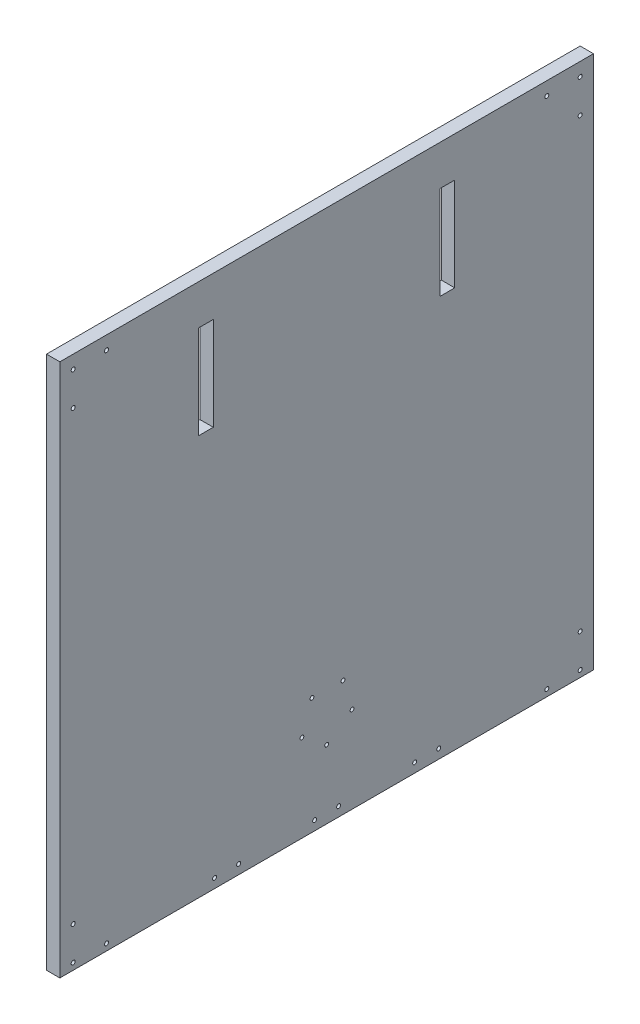
ISO-10303-21;
HEADER;
FILE_DESCRIPTION(('STEP AP214'),'2;1');
FILE_NAME('part.step','',(''),(''),'','','');
FILE_SCHEMA(('AUTOMOTIVE_DESIGN { 1 0 10303 214 1 1 1 1 }'));
ENDSEC;
DATA;
#1=APPLICATION_CONTEXT('core data for automotive mechanical design processes');
#2=APPLICATION_PROTOCOL_DEFINITION('international standard','automotive_design',2000,#1);
#3=PRODUCT_CONTEXT('',#1,'mechanical');
#4=PRODUCT('Part','Part','',(#3));
#5=PRODUCT_RELATED_PRODUCT_CATEGORY('part','',(#4));
#6=PRODUCT_DEFINITION_FORMATION('','',#4);
#7=PRODUCT_DEFINITION_CONTEXT('part definition',#1,'design');
#8=PRODUCT_DEFINITION('design','',#6,#7);
#9=PRODUCT_DEFINITION_SHAPE('','',#8);
#10=(LENGTH_UNIT() NAMED_UNIT(*) SI_UNIT(.MILLI.,.METRE.));
#11=(NAMED_UNIT(*) PLANE_ANGLE_UNIT() SI_UNIT($,.RADIAN.));
#12=(NAMED_UNIT(*) SI_UNIT($,.STERADIAN.) SOLID_ANGLE_UNIT());
#13=UNCERTAINTY_MEASURE_WITH_UNIT(LENGTH_MEASURE(1.E-05),#10,'distance_accuracy_value','');
#14=(GEOMETRIC_REPRESENTATION_CONTEXT(3) GLOBAL_UNCERTAINTY_ASSIGNED_CONTEXT((#13)) GLOBAL_UNIT_ASSIGNED_CONTEXT((#10,
#11,#12)) REPRESENTATION_CONTEXT('',''));
#15=CARTESIAN_POINT('',(0.,0.,0.));
#16=DIRECTION('',(0.,0.,1.));
#17=DIRECTION('',(1.,0.,0.));
#18=AXIS2_PLACEMENT_3D('',#15,#16,#17);
#19=CARTESIAN_POINT('',(10.,0.,0.));
#20=DIRECTION('',(1.,0.,0.));
#21=DIRECTION('',(0.,0.,-1.));
#22=AXIS2_PLACEMENT_3D('',#19,#20,#21);
#23=PLANE('',#22);
#24=DIRECTION('',(0.,0.,-1.));
#25=VECTOR('',#24,1.);
#26=CARTESIAN_POINT('',(10.,170.,96.));
#27=LINE('',#26,#25);
#28=CARTESIAN_POINT('',(10.,170.,96.));
#29=VERTEX_POINT('',#28);
#30=CARTESIAN_POINT('',(10.,170.,85.));
#31=VERTEX_POINT('',#30);
#32=EDGE_CURVE('E134',#29,#31,#27,.T.);
#33=ORIENTED_EDGE('',*,*,#32,.T.);
#34=DIRECTION('',(0.,-1.,0.));
#35=VECTOR('',#34,1.);
#36=CARTESIAN_POINT('',(10.,170.,85.));
#37=LINE('',#36,#35);
#38=CARTESIAN_POINT('',(10.,100.,85.));
#39=VERTEX_POINT('',#38);
#40=EDGE_CURVE('E146',#31,#39,#37,.T.);
#41=ORIENTED_EDGE('',*,*,#40,.T.);
#42=DIRECTION('',(0.,0.,1.));
#43=VECTOR('',#42,1.);
#44=CARTESIAN_POINT('',(10.,100.,85.));
#45=LINE('',#44,#43);
#46=CARTESIAN_POINT('',(10.,100.,96.));
#47=VERTEX_POINT('',#46);
#48=EDGE_CURVE('E57',#39,#47,#45,.T.);
#49=ORIENTED_EDGE('',*,*,#48,.T.);
#50=DIRECTION('',(0.,1.,0.));
#51=VECTOR('',#50,1.);
#52=CARTESIAN_POINT('',(10.,100.,96.));
#53=LINE('',#52,#51);
#54=EDGE_CURVE('E143',#47,#29,#53,.T.);
#55=ORIENTED_EDGE('',*,*,#54,.T.);
#56=EDGE_LOOP('',(#33,#41,#49,#55));
#57=FACE_BOUND('',#56,.T.);
#58=CARTESIAN_POINT('',(10.,-113.022211572453,-12.2380282533939));
#59=DIRECTION('',(1.,0.,0.));
#60=DIRECTION('',(0.,0.,-1.));
#61=AXIS2_PLACEMENT_3D('',#58,#59,#60);
#62=CIRCLE('',#61,1.45000000000002);
#63=CARTESIAN_POINT('',(10.,-113.022211572453,-13.6880282533939));
#64=VERTEX_POINT('',#63);
#65=EDGE_CURVE('E244',#64,#64,#62,.T.);
#66=ORIENTED_EDGE('',*,*,#65,.F.);
#67=EDGE_LOOP('',(#66));
#68=FACE_BOUND('',#67,.T.);
#69=CARTESIAN_POINT('',(10.,-134.607193772722,18.571414113098));
#70=DIRECTION('',(1.,0.,0.));
#71=DIRECTION('',(0.,0.,-1.));
#72=AXIS2_PLACEMENT_3D('',#69,#70,#71);
#73=CIRCLE('',#72,1.44999999999999);
#74=CARTESIAN_POINT('',(10.,-134.607193772722,17.121414113098));
#75=VERTEX_POINT('',#74);
#76=EDGE_CURVE('E227',#75,#75,#73,.T.);
#77=ORIENTED_EDGE('',*,*,#76,.F.);
#78=EDGE_LOOP('',(#77));
#79=FACE_BOUND('',#78,.T.);
#80=CARTESIAN_POINT('',(10.,-135.253912203802,-19.0412825569231));
#81=DIRECTION('',(1.,0.,0.));
#82=DIRECTION('',(0.,0.,-1.));
#83=AXIS2_PLACEMENT_3D('',#80,#81,#82);
#84=CIRCLE('',#83,1.44999999999997);
#85=CARTESIAN_POINT('',(10.,-135.253912203802,-20.491282556923));
#86=VERTEX_POINT('',#85);
#87=EDGE_CURVE('E228',#86,#86,#84,.T.);
#88=ORIENTED_EDGE('',*,*,#87,.F.);
#89=EDGE_LOOP('',(#88));
#90=FACE_BOUND('',#89,.T.);
#91=CARTESIAN_POINT('',(10.,-148.59416485013,0.));
#92=DIRECTION('',(1.,0.,0.));
#93=DIRECTION('',(0.,0.,-1.));
#94=AXIS2_PLACEMENT_3D('',#91,#92,#93);
#95=CIRCLE('',#94,1.44999999999995);
#96=CARTESIAN_POINT('',(10.,-148.59416485013,-1.45000000000003));
#97=VERTEX_POINT('',#96);
#98=EDGE_CURVE('E177',#97,#97,#95,.T.);
#99=ORIENTED_EDGE('',*,*,#98,.F.);
#100=EDGE_LOOP('',(#99));
#101=FACE_BOUND('',#100,.T.);
#102=CARTESIAN_POINT('',(10.,-112.622517600894,11.0078966972191));
#103=DIRECTION('',(1.,0.,0.));
#104=DIRECTION('',(0.,0.,-1.));
#105=AXIS2_PLACEMENT_3D('',#102,#103,#104);
#106=CIRCLE('',#105,1.45000000000004);
#107=CARTESIAN_POINT('',(10.,-112.622517600894,9.55789669721902));
#108=VERTEX_POINT('',#107);
#109=EDGE_CURVE('E243',#108,#108,#106,.T.);
#110=ORIENTED_EDGE('',*,*,#109,.F.);
#111=EDGE_LOOP('',(#110));
#112=FACE_BOUND('',#111,.T.);
#113=CARTESIAN_POINT('',(10.,190.,165.));
#114=DIRECTION('',(-1.,0.,0.));
#115=DIRECTION('',(0.,0.,1.));
#116=AXIS2_PLACEMENT_3D('',#113,#114,#115);
#117=CIRCLE('',#116,1.5);
#118=CARTESIAN_POINT('',(10.,190.,166.5));
#119=VERTEX_POINT('',#118);
#120=EDGE_CURVE('E276',#119,#119,#117,.T.);
#121=ORIENTED_EDGE('',*,*,#120,.T.);
#122=EDGE_LOOP('',(#121));
#123=FACE_BOUND('',#122,.T.);
#124=CARTESIAN_POINT('',(10.,165.,190.));
#125=DIRECTION('',(-1.,0.,0.));
#126=DIRECTION('',(0.,0.,1.));
#127=AXIS2_PLACEMENT_3D('',#124,#125,#126);
#128=CIRCLE('',#127,1.5);
#129=CARTESIAN_POINT('',(10.,165.,191.5));
#130=VERTEX_POINT('',#129);
#131=EDGE_CURVE('E284',#130,#130,#128,.T.);
#132=ORIENTED_EDGE('',*,*,#131,.T.);
#133=EDGE_LOOP('',(#132));
#134=FACE_BOUND('',#133,.T.);
#135=CARTESIAN_POINT('',(10.,-195.,190.));
#136=DIRECTION('',(-1.,0.,0.));
#137=DIRECTION('',(0.,0.,1.));
#138=AXIS2_PLACEMENT_3D('',#135,#136,#137);
#139=CIRCLE('',#138,1.5);
#140=CARTESIAN_POINT('',(10.,-195.,191.5));
#141=VERTEX_POINT('',#140);
#142=EDGE_CURVE('E292',#141,#141,#139,.T.);
#143=ORIENTED_EDGE('',*,*,#142,.T.);
#144=EDGE_LOOP('',(#143));
#145=FACE_BOUND('',#144,.T.);
#146=CARTESIAN_POINT('',(10.,-195.,165.));
#147=DIRECTION('',(-1.,0.,0.));
#148=DIRECTION('',(0.,0.,1.));
#149=AXIS2_PLACEMENT_3D('',#146,#147,#148);
#150=CIRCLE('',#149,1.5);
#151=CARTESIAN_POINT('',(10.,-195.,166.5));
#152=VERTEX_POINT('',#151);
#153=EDGE_CURVE('E267',#152,#152,#150,.T.);
#154=ORIENTED_EDGE('',*,*,#153,.T.);
#155=EDGE_LOOP('',(#154));
#156=FACE_BOUND('',#155,.T.);
#157=CARTESIAN_POINT('',(10.,-170.,190.));
#158=DIRECTION('',(-1.,0.,0.));
#159=DIRECTION('',(0.,0.,1.));
#160=AXIS2_PLACEMENT_3D('',#157,#158,#159);
#161=CIRCLE('',#160,1.5);
#162=CARTESIAN_POINT('',(10.,-170.,191.5));
#163=VERTEX_POINT('',#162);
#164=EDGE_CURVE('E259',#163,#163,#161,.T.);
#165=ORIENTED_EDGE('',*,*,#164,.T.);
#166=EDGE_LOOP('',(#165));
#167=FACE_BOUND('',#166,.T.);
#168=CARTESIAN_POINT('',(10.,190.,190.));
#169=DIRECTION('',(-1.,0.,0.));
#170=DIRECTION('',(0.,0.,1.));
#171=AXIS2_PLACEMENT_3D('',#168,#169,#170);
#172=CIRCLE('',#171,1.5);
#173=CARTESIAN_POINT('',(10.,190.,191.5));
#174=VERTEX_POINT('',#173);
#175=EDGE_CURVE('E275',#174,#174,#172,.T.);
#176=ORIENTED_EDGE('',*,*,#175,.T.);
#177=EDGE_LOOP('',(#176));
#178=FACE_BOUND('',#177,.T.);
#179=CARTESIAN_POINT('',(10.,-193.,84.));
#180=DIRECTION('',(1.,0.,0.));
#181=DIRECTION('',(0.,0.,-1.));
#182=AXIS2_PLACEMENT_3D('',#179,#180,#181);
#183=CIRCLE('',#182,1.5);
#184=CARTESIAN_POINT('',(10.,-193.,82.5));
#185=VERTEX_POINT('',#184);
#186=EDGE_CURVE('E316',#185,#185,#183,.T.);
#187=ORIENTED_EDGE('',*,*,#186,.F.);
#188=EDGE_LOOP('',(#187));
#189=FACE_BOUND('',#188,.T.);
#190=CARTESIAN_POINT('',(10.,-193.,66.));
#191=DIRECTION('',(1.,0.,0.));
#192=DIRECTION('',(0.,0.,-1.));
#193=AXIS2_PLACEMENT_3D('',#190,#191,#192);
#194=CIRCLE('',#193,1.5);
#195=CARTESIAN_POINT('',(10.,-193.,64.5));
#196=VERTEX_POINT('',#195);
#197=EDGE_CURVE('E324',#196,#196,#194,.T.);
#198=ORIENTED_EDGE('',*,*,#197,.F.);
#199=EDGE_LOOP('',(#198));
#200=FACE_BOUND('',#199,.T.);
#201=CARTESIAN_POINT('',(10.,-193.,9.));
#202=DIRECTION('',(1.,0.,0.));
#203=DIRECTION('',(0.,0.,-1.));
#204=AXIS2_PLACEMENT_3D('',#201,#202,#203);
#205=CIRCLE('',#204,1.5);
#206=CARTESIAN_POINT('',(10.,-193.,7.5));
#207=VERTEX_POINT('',#206);
#208=EDGE_CURVE('E332',#207,#207,#205,.T.);
#209=ORIENTED_EDGE('',*,*,#208,.F.);
#210=EDGE_LOOP('',(#209));
#211=FACE_BOUND('',#210,.T.);
#212=CARTESIAN_POINT('',(10.,-193.,-9.));
#213=DIRECTION('',(1.,0.,0.));
#214=DIRECTION('',(0.,0.,-1.));
#215=AXIS2_PLACEMENT_3D('',#212,#213,#214);
#216=CIRCLE('',#215,1.5);
#217=CARTESIAN_POINT('',(10.,-193.,-10.5));
#218=VERTEX_POINT('',#217);
#219=EDGE_CURVE('E340',#218,#218,#216,.T.);
#220=ORIENTED_EDGE('',*,*,#219,.F.);
#221=EDGE_LOOP('',(#220));
#222=FACE_BOUND('',#221,.T.);
#223=CARTESIAN_POINT('',(10.,-193.,-66.));
#224=DIRECTION('',(1.,0.,0.));
#225=DIRECTION('',(0.,0.,-1.));
#226=AXIS2_PLACEMENT_3D('',#223,#224,#225);
#227=CIRCLE('',#226,1.5);
#228=CARTESIAN_POINT('',(10.,-193.,-67.5));
#229=VERTEX_POINT('',#228);
#230=EDGE_CURVE('E348',#229,#229,#227,.T.);
#231=ORIENTED_EDGE('',*,*,#230,.F.);
#232=EDGE_LOOP('',(#231));
#233=FACE_BOUND('',#232,.T.);
#234=CARTESIAN_POINT('',(10.,-193.,-84.));
#235=DIRECTION('',(1.,0.,0.));
#236=DIRECTION('',(0.,0.,-1.));
#237=AXIS2_PLACEMENT_3D('',#234,#235,#236);
#238=CIRCLE('',#237,1.5);
#239=CARTESIAN_POINT('',(10.,-193.,-85.5));
#240=VERTEX_POINT('',#239);
#241=EDGE_CURVE('E307',#240,#240,#238,.T.);
#242=ORIENTED_EDGE('',*,*,#241,.F.);
#243=EDGE_LOOP('',(#242));
#244=FACE_BOUND('',#243,.T.);
#245=CARTESIAN_POINT('',(10.,190.,-165.));
#246=DIRECTION('',(1.,0.,0.));
#247=DIRECTION('',(0.,0.,-1.));
#248=AXIS2_PLACEMENT_3D('',#245,#246,#247);
#249=CIRCLE('',#248,1.5);
#250=CARTESIAN_POINT('',(10.,190.,-166.5));
#251=VERTEX_POINT('',#250);
#252=EDGE_CURVE('E372',#251,#251,#249,.T.);
#253=ORIENTED_EDGE('',*,*,#252,.F.);
#254=EDGE_LOOP('',(#253));
#255=FACE_BOUND('',#254,.T.);
#256=CARTESIAN_POINT('',(10.,165.,-190.));
#257=DIRECTION('',(1.,0.,0.));
#258=DIRECTION('',(0.,0.,-1.));
#259=AXIS2_PLACEMENT_3D('',#256,#257,#258);
#260=CIRCLE('',#259,1.5);
#261=CARTESIAN_POINT('',(10.,165.,-191.5));
#262=VERTEX_POINT('',#261);
#263=EDGE_CURVE('E380',#262,#262,#260,.T.);
#264=ORIENTED_EDGE('',*,*,#263,.F.);
#265=EDGE_LOOP('',(#264));
#266=FACE_BOUND('',#265,.T.);
#267=CARTESIAN_POINT('',(10.,-195.,-190.));
#268=DIRECTION('',(1.,0.,0.));
#269=DIRECTION('',(0.,0.,-1.));
#270=AXIS2_PLACEMENT_3D('',#267,#268,#269);
#271=CIRCLE('',#270,1.5);
#272=CARTESIAN_POINT('',(10.,-195.,-191.5));
#273=VERTEX_POINT('',#272);
#274=EDGE_CURVE('E388',#273,#273,#271,.T.);
#275=ORIENTED_EDGE('',*,*,#274,.F.);
#276=EDGE_LOOP('',(#275));
#277=FACE_BOUND('',#276,.T.);
#278=CARTESIAN_POINT('',(10.,-195.,-165.));
#279=DIRECTION('',(1.,0.,0.));
#280=DIRECTION('',(0.,0.,-1.));
#281=AXIS2_PLACEMENT_3D('',#278,#279,#280);
#282=CIRCLE('',#281,1.5);
#283=CARTESIAN_POINT('',(10.,-195.,-166.5));
#284=VERTEX_POINT('',#283);
#285=EDGE_CURVE('E363',#284,#284,#282,.T.);
#286=ORIENTED_EDGE('',*,*,#285,.F.);
#287=EDGE_LOOP('',(#286));
#288=FACE_BOUND('',#287,.T.);
#289=CARTESIAN_POINT('',(10.,-170.,-190.));
#290=DIRECTION('',(1.,0.,0.));
#291=DIRECTION('',(0.,0.,-1.));
#292=AXIS2_PLACEMENT_3D('',#289,#290,#291);
#293=CIRCLE('',#292,1.5);
#294=CARTESIAN_POINT('',(10.,-170.,-191.5));
#295=VERTEX_POINT('',#294);
#296=EDGE_CURVE('E315',#295,#295,#293,.T.);
#297=ORIENTED_EDGE('',*,*,#296,.F.);
#298=EDGE_LOOP('',(#297));
#299=FACE_BOUND('',#298,.T.);
#300=CARTESIAN_POINT('',(10.,190.,-190.));
#301=DIRECTION('',(1.,0.,0.));
#302=DIRECTION('',(0.,0.,-1.));
#303=AXIS2_PLACEMENT_3D('',#300,#301,#302);
#304=CIRCLE('',#303,1.5);
#305=CARTESIAN_POINT('',(10.,190.,-191.5));
#306=VERTEX_POINT('',#305);
#307=EDGE_CURVE('E371',#306,#306,#304,.T.);
#308=ORIENTED_EDGE('',*,*,#307,.F.);
#309=EDGE_LOOP('',(#308));
#310=FACE_BOUND('',#309,.T.);
#311=DIRECTION('',(0.,-1.,0.));
#312=VECTOR('',#311,1.);
#313=CARTESIAN_POINT('',(10.,0.,-200.));
#314=LINE('',#313,#312);
#315=CARTESIAN_POINT('',(10.,200.,-200.));
#316=VERTEX_POINT('',#315);
#317=CARTESIAN_POINT('',(10.,-200.,-200.));
#318=VERTEX_POINT('',#317);
#319=EDGE_CURVE('E407',#316,#318,#314,.T.);
#320=ORIENTED_EDGE('',*,*,#319,.F.);
#321=DIRECTION('',(0.,0.,-1.));
#322=VECTOR('',#321,1.);
#323=CARTESIAN_POINT('',(10.,200.,0.));
#324=LINE('',#323,#322);
#325=CARTESIAN_POINT('',(10.,200.,200.));
#326=VERTEX_POINT('',#325);
#327=EDGE_CURVE('E411',#326,#316,#324,.T.);
#328=ORIENTED_EDGE('',*,*,#327,.F.);
#329=DIRECTION('',(0.,-1.,0.));
#330=VECTOR('',#329,1.);
#331=CARTESIAN_POINT('',(10.,0.,200.));
#332=LINE('',#331,#330);
#333=CARTESIAN_POINT('',(10.,-200.,200.));
#334=VERTEX_POINT('',#333);
#335=EDGE_CURVE('E416',#326,#334,#332,.T.);
#336=ORIENTED_EDGE('',*,*,#335,.T.);
#337=DIRECTION('',(0.,0.,-1.));
#338=VECTOR('',#337,1.);
#339=CARTESIAN_POINT('',(10.,-200.,0.));
#340=LINE('',#339,#338);
#341=EDGE_CURVE('E419',#334,#318,#340,.T.);
#342=ORIENTED_EDGE('',*,*,#341,.T.);
#343=EDGE_LOOP('',(#320,#328,#336,#342));
#344=FACE_BOUND('',#343,.T.);
#345=DIRECTION('',(0.,1.,0.));
#346=VECTOR('',#345,1.);
#347=CARTESIAN_POINT('',(10.,99.9999999999999,-96.));
#348=LINE('',#347,#346);
#349=CARTESIAN_POINT('',(10.,99.9999999999999,-96.));
#350=VERTEX_POINT('',#349);
#351=CARTESIAN_POINT('',(10.,170.,-96.));
#352=VERTEX_POINT('',#351);
#353=EDGE_CURVE('E218',#350,#352,#348,.T.);
#354=ORIENTED_EDGE('',*,*,#353,.F.);
#355=DIRECTION('',(0.,0.,-1.));
#356=VECTOR('',#355,1.);
#357=CARTESIAN_POINT('',(10.,99.9999999999999,-85.));
#358=LINE('',#357,#356);
#359=CARTESIAN_POINT('',(10.,99.9999999999999,-85.));
#360=VERTEX_POINT('',#359);
#361=EDGE_CURVE('E202',#360,#350,#358,.T.);
#362=ORIENTED_EDGE('',*,*,#361,.F.);
#363=DIRECTION('',(0.,-1.,0.));
#364=VECTOR('',#363,1.);
#365=CARTESIAN_POINT('',(10.,170.,-85.));
#366=LINE('',#365,#364);
#367=CARTESIAN_POINT('',(10.,170.,-85.));
#368=VERTEX_POINT('',#367);
#369=EDGE_CURVE('E196',#368,#360,#366,.T.);
#370=ORIENTED_EDGE('',*,*,#369,.F.);
#371=DIRECTION('',(0.,0.,1.));
#372=VECTOR('',#371,1.);
#373=CARTESIAN_POINT('',(10.,170.,-96.));
#374=LINE('',#373,#372);
#375=EDGE_CURVE('E215',#352,#368,#374,.T.);
#376=ORIENTED_EDGE('',*,*,#375,.F.);
#377=EDGE_LOOP('',(#354,#362,#370,#376));
#378=FACE_BOUND('',#377,.T.);
#379=ADVANCED_FACE('F41',(#57,#68,#79,#90,#101,#112,#123,#134,#145,#156,#167,#178,#189,#200,
#211,#222,#233,#244,#255,#266,#277,#288,#299,#310,#344,#378),#23,.T.);
#380=CARTESIAN_POINT('',(0.,0.,0.));
#381=DIRECTION('',(1.,0.,0.));
#382=DIRECTION('',(0.,0.,-1.));
#383=AXIS2_PLACEMENT_3D('',#380,#381,#382);
#384=PLANE('',#383);
#385=DIRECTION('',(0.,-1.,0.));
#386=VECTOR('',#385,1.);
#387=CARTESIAN_POINT('',(0.,170.,85.));
#388=LINE('',#387,#386);
#389=CARTESIAN_POINT('',(0.,170.,85.));
#390=VERTEX_POINT('',#389);
#391=CARTESIAN_POINT('',(0.,100.,85.));
#392=VERTEX_POINT('',#391);
#393=EDGE_CURVE('E167',#390,#392,#388,.T.);
#394=ORIENTED_EDGE('',*,*,#393,.F.);
#395=DIRECTION('',(0.,0.,-1.));
#396=VECTOR('',#395,1.);
#397=CARTESIAN_POINT('',(0.,170.,96.));
#398=LINE('',#397,#396);
#399=CARTESIAN_POINT('',(0.,170.,96.));
#400=VERTEX_POINT('',#399);
#401=EDGE_CURVE('E137',#400,#390,#398,.T.);
#402=ORIENTED_EDGE('',*,*,#401,.F.);
#403=DIRECTION('',(0.,1.,0.));
#404=VECTOR('',#403,1.);
#405=CARTESIAN_POINT('',(0.,100.,96.));
#406=LINE('',#405,#404);
#407=CARTESIAN_POINT('',(0.,100.,96.));
#408=VERTEX_POINT('',#407);
#409=EDGE_CURVE('E154',#408,#400,#406,.T.);
#410=ORIENTED_EDGE('',*,*,#409,.F.);
#411=DIRECTION('',(0.,0.,1.));
#412=VECTOR('',#411,1.);
#413=CARTESIAN_POINT('',(0.,100.,85.));
#414=LINE('',#413,#412);
#415=EDGE_CURVE('E158',#392,#408,#414,.T.);
#416=ORIENTED_EDGE('',*,*,#415,.F.);
#417=EDGE_LOOP('',(#394,#402,#410,#416));
#418=FACE_BOUND('',#417,.T.);
#419=DIRECTION('',(0.,-1.,0.));
#420=VECTOR('',#419,1.);
#421=CARTESIAN_POINT('',(0.,0.,-200.));
#422=LINE('',#421,#420);
#423=CARTESIAN_POINT('',(0.,200.,-200.));
#424=VERTEX_POINT('',#423);
#425=CARTESIAN_POINT('',(0.,-200.,-200.));
#426=VERTEX_POINT('',#425);
#427=EDGE_CURVE('E403',#424,#426,#422,.T.);
#428=ORIENTED_EDGE('',*,*,#427,.T.);
#429=DIRECTION('',(0.,0.,-1.));
#430=VECTOR('',#429,1.);
#431=CARTESIAN_POINT('',(0.,-200.,0.));
#432=LINE('',#431,#430);
#433=CARTESIAN_POINT('',(0.,-200.,200.));
#434=VERTEX_POINT('',#433);
#435=EDGE_CURVE('E412',#434,#426,#432,.T.);
#436=ORIENTED_EDGE('',*,*,#435,.F.);
#437=DIRECTION('',(0.,-1.,0.));
#438=VECTOR('',#437,1.);
#439=CARTESIAN_POINT('',(0.,0.,200.));
#440=LINE('',#439,#438);
#441=CARTESIAN_POINT('',(0.,200.,200.));
#442=VERTEX_POINT('',#441);
#443=EDGE_CURVE('E430',#442,#434,#440,.T.);
#444=ORIENTED_EDGE('',*,*,#443,.F.);
#445=DIRECTION('',(0.,0.,-1.));
#446=VECTOR('',#445,1.);
#447=CARTESIAN_POINT('',(0.,200.,0.));
#448=LINE('',#447,#446);
#449=EDGE_CURVE('E426',#442,#424,#448,.T.);
#450=ORIENTED_EDGE('',*,*,#449,.T.);
#451=EDGE_LOOP('',(#428,#436,#444,#450));
#452=FACE_BOUND('',#451,.T.);
#453=CARTESIAN_POINT('',(0.,190.,-190.));
#454=DIRECTION('',(1.,0.,0.));
#455=DIRECTION('',(0.,0.,-1.));
#456=AXIS2_PLACEMENT_3D('',#453,#454,#455);
#457=CIRCLE('',#456,1.5);
#458=CARTESIAN_POINT('',(0.,190.,-191.5));
#459=VERTEX_POINT('',#458);
#460=EDGE_CURVE('E399',#459,#459,#457,.T.);
#461=ORIENTED_EDGE('',*,*,#460,.T.);
#462=EDGE_LOOP('',(#461));
#463=FACE_BOUND('',#462,.T.);
#464=CARTESIAN_POINT('',(0.,-170.,-190.));
#465=DIRECTION('',(1.,0.,0.));
#466=DIRECTION('',(0.,0.,-1.));
#467=AXIS2_PLACEMENT_3D('',#464,#465,#466);
#468=CIRCLE('',#467,1.5);
#469=CARTESIAN_POINT('',(0.,-170.,-191.5));
#470=VERTEX_POINT('',#469);
#471=EDGE_CURVE('E359',#470,#470,#468,.T.);
#472=ORIENTED_EDGE('',*,*,#471,.T.);
#473=EDGE_LOOP('',(#472));
#474=FACE_BOUND('',#473,.T.);
#475=CARTESIAN_POINT('',(0.,-195.,-165.));
#476=DIRECTION('',(1.,0.,0.));
#477=DIRECTION('',(0.,0.,-1.));
#478=AXIS2_PLACEMENT_3D('',#475,#476,#477);
#479=CIRCLE('',#478,1.5);
#480=CARTESIAN_POINT('',(0.,-195.,-166.5));
#481=VERTEX_POINT('',#480);
#482=EDGE_CURVE('E392',#481,#481,#479,.T.);
#483=ORIENTED_EDGE('',*,*,#482,.T.);
#484=EDGE_LOOP('',(#483));
#485=FACE_BOUND('',#484,.T.);
#486=CARTESIAN_POINT('',(0.,-195.,-190.));
#487=DIRECTION('',(1.,0.,0.));
#488=DIRECTION('',(0.,0.,-1.));
#489=AXIS2_PLACEMENT_3D('',#486,#487,#488);
#490=CIRCLE('',#489,1.5);
#491=CARTESIAN_POINT('',(0.,-195.,-191.5));
#492=VERTEX_POINT('',#491);
#493=EDGE_CURVE('E384',#492,#492,#490,.T.);
#494=ORIENTED_EDGE('',*,*,#493,.T.);
#495=EDGE_LOOP('',(#494));
#496=FACE_BOUND('',#495,.T.);
#497=CARTESIAN_POINT('',(0.,165.,-190.));
#498=DIRECTION('',(1.,0.,0.));
#499=DIRECTION('',(0.,0.,-1.));
#500=AXIS2_PLACEMENT_3D('',#497,#498,#499);
#501=CIRCLE('',#500,1.5);
#502=CARTESIAN_POINT('',(0.,165.,-191.5));
#503=VERTEX_POINT('',#502);
#504=EDGE_CURVE('E376',#503,#503,#501,.T.);
#505=ORIENTED_EDGE('',*,*,#504,.T.);
#506=EDGE_LOOP('',(#505));
#507=FACE_BOUND('',#506,.T.);
#508=CARTESIAN_POINT('',(0.,190.,-165.));
#509=DIRECTION('',(1.,0.,0.));
#510=DIRECTION('',(0.,0.,-1.));
#511=AXIS2_PLACEMENT_3D('',#508,#509,#510);
#512=CIRCLE('',#511,1.5);
#513=CARTESIAN_POINT('',(0.,190.,-166.5));
#514=VERTEX_POINT('',#513);
#515=EDGE_CURVE('E367',#514,#514,#512,.T.);
#516=ORIENTED_EDGE('',*,*,#515,.T.);
#517=EDGE_LOOP('',(#516));
#518=FACE_BOUND('',#517,.T.);
#519=CARTESIAN_POINT('',(0.,-193.,-84.));
#520=DIRECTION('',(1.,0.,0.));
#521=DIRECTION('',(0.,0.,-1.));
#522=AXIS2_PLACEMENT_3D('',#519,#520,#521);
#523=CIRCLE('',#522,1.5);
#524=CARTESIAN_POINT('',(0.,-193.,-85.5));
#525=VERTEX_POINT('',#524);
#526=EDGE_CURVE('E352',#525,#525,#523,.T.);
#527=ORIENTED_EDGE('',*,*,#526,.T.);
#528=EDGE_LOOP('',(#527));
#529=FACE_BOUND('',#528,.T.);
#530=CARTESIAN_POINT('',(0.,-193.,-66.));
#531=DIRECTION('',(1.,0.,0.));
#532=DIRECTION('',(0.,0.,-1.));
#533=AXIS2_PLACEMENT_3D('',#530,#531,#532);
#534=CIRCLE('',#533,1.5);
#535=CARTESIAN_POINT('',(0.,-193.,-67.5));
#536=VERTEX_POINT('',#535);
#537=EDGE_CURVE('E344',#536,#536,#534,.T.);
#538=ORIENTED_EDGE('',*,*,#537,.T.);
#539=EDGE_LOOP('',(#538));
#540=FACE_BOUND('',#539,.T.);
#541=CARTESIAN_POINT('',(0.,-193.,-9.));
#542=DIRECTION('',(1.,0.,0.));
#543=DIRECTION('',(0.,0.,-1.));
#544=AXIS2_PLACEMENT_3D('',#541,#542,#543);
#545=CIRCLE('',#544,1.5);
#546=CARTESIAN_POINT('',(0.,-193.,-10.5));
#547=VERTEX_POINT('',#546);
#548=EDGE_CURVE('E336',#547,#547,#545,.T.);
#549=ORIENTED_EDGE('',*,*,#548,.T.);
#550=EDGE_LOOP('',(#549));
#551=FACE_BOUND('',#550,.T.);
#552=CARTESIAN_POINT('',(0.,-193.,9.));
#553=DIRECTION('',(1.,0.,0.));
#554=DIRECTION('',(0.,0.,-1.));
#555=AXIS2_PLACEMENT_3D('',#552,#553,#554);
#556=CIRCLE('',#555,1.5);
#557=CARTESIAN_POINT('',(0.,-193.,7.5));
#558=VERTEX_POINT('',#557);
#559=EDGE_CURVE('E328',#558,#558,#556,.T.);
#560=ORIENTED_EDGE('',*,*,#559,.T.);
#561=EDGE_LOOP('',(#560));
#562=FACE_BOUND('',#561,.T.);
#563=CARTESIAN_POINT('',(0.,-193.,66.));
#564=DIRECTION('',(1.,0.,0.));
#565=DIRECTION('',(0.,0.,-1.));
#566=AXIS2_PLACEMENT_3D('',#563,#564,#565);
#567=CIRCLE('',#566,1.5);
#568=CARTESIAN_POINT('',(0.,-193.,64.5));
#569=VERTEX_POINT('',#568);
#570=EDGE_CURVE('E320',#569,#569,#567,.T.);
#571=ORIENTED_EDGE('',*,*,#570,.T.);
#572=EDGE_LOOP('',(#571));
#573=FACE_BOUND('',#572,.T.);
#574=CARTESIAN_POINT('',(0.,-193.,84.));
#575=DIRECTION('',(1.,0.,0.));
#576=DIRECTION('',(0.,0.,-1.));
#577=AXIS2_PLACEMENT_3D('',#574,#575,#576);
#578=CIRCLE('',#577,1.5);
#579=CARTESIAN_POINT('',(0.,-193.,82.5));
#580=VERTEX_POINT('',#579);
#581=EDGE_CURVE('E311',#580,#580,#578,.T.);
#582=ORIENTED_EDGE('',*,*,#581,.T.);
#583=EDGE_LOOP('',(#582));
#584=FACE_BOUND('',#583,.T.);
#585=CARTESIAN_POINT('',(0.,190.,190.));
#586=DIRECTION('',(-1.,0.,0.));
#587=DIRECTION('',(0.,0.,1.));
#588=AXIS2_PLACEMENT_3D('',#585,#586,#587);
#589=CIRCLE('',#588,1.5);
#590=CARTESIAN_POINT('',(0.,190.,191.5));
#591=VERTEX_POINT('',#590);
#592=EDGE_CURVE('E303',#591,#591,#589,.T.);
#593=ORIENTED_EDGE('',*,*,#592,.F.);
#594=EDGE_LOOP('',(#593));
#595=FACE_BOUND('',#594,.T.);
#596=CARTESIAN_POINT('',(0.,-170.,190.));
#597=DIRECTION('',(-1.,0.,0.));
#598=DIRECTION('',(0.,0.,1.));
#599=AXIS2_PLACEMENT_3D('',#596,#597,#598);
#600=CIRCLE('',#599,1.5);
#601=CARTESIAN_POINT('',(0.,-170.,191.5));
#602=VERTEX_POINT('',#601);
#603=EDGE_CURVE('E263',#602,#602,#600,.T.);
#604=ORIENTED_EDGE('',*,*,#603,.F.);
#605=EDGE_LOOP('',(#604));
#606=FACE_BOUND('',#605,.T.);
#607=CARTESIAN_POINT('',(0.,-195.,165.));
#608=DIRECTION('',(-1.,0.,0.));
#609=DIRECTION('',(0.,0.,1.));
#610=AXIS2_PLACEMENT_3D('',#607,#608,#609);
#611=CIRCLE('',#610,1.5);
#612=CARTESIAN_POINT('',(0.,-195.,166.5));
#613=VERTEX_POINT('',#612);
#614=EDGE_CURVE('E296',#613,#613,#611,.T.);
#615=ORIENTED_EDGE('',*,*,#614,.F.);
#616=EDGE_LOOP('',(#615));
#617=FACE_BOUND('',#616,.T.);
#618=CARTESIAN_POINT('',(0.,-195.,190.));
#619=DIRECTION('',(-1.,0.,0.));
#620=DIRECTION('',(0.,0.,1.));
#621=AXIS2_PLACEMENT_3D('',#618,#619,#620);
#622=CIRCLE('',#621,1.5);
#623=CARTESIAN_POINT('',(0.,-195.,191.5));
#624=VERTEX_POINT('',#623);
#625=EDGE_CURVE('E288',#624,#624,#622,.T.);
#626=ORIENTED_EDGE('',*,*,#625,.F.);
#627=EDGE_LOOP('',(#626));
#628=FACE_BOUND('',#627,.T.);
#629=CARTESIAN_POINT('',(0.,165.,190.));
#630=DIRECTION('',(-1.,0.,0.));
#631=DIRECTION('',(0.,0.,1.));
#632=AXIS2_PLACEMENT_3D('',#629,#630,#631);
#633=CIRCLE('',#632,1.5);
#634=CARTESIAN_POINT('',(0.,165.,191.5));
#635=VERTEX_POINT('',#634);
#636=EDGE_CURVE('E280',#635,#635,#633,.T.);
#637=ORIENTED_EDGE('',*,*,#636,.F.);
#638=EDGE_LOOP('',(#637));
#639=FACE_BOUND('',#638,.T.);
#640=CARTESIAN_POINT('',(0.,190.,165.));
#641=DIRECTION('',(-1.,0.,0.));
#642=DIRECTION('',(0.,0.,1.));
#643=AXIS2_PLACEMENT_3D('',#640,#641,#642);
#644=CIRCLE('',#643,1.5);
#645=CARTESIAN_POINT('',(0.,190.,166.5));
#646=VERTEX_POINT('',#645);
#647=EDGE_CURVE('E271',#646,#646,#644,.T.);
#648=ORIENTED_EDGE('',*,*,#647,.F.);
#649=EDGE_LOOP('',(#648));
#650=FACE_BOUND('',#649,.T.);
#651=CARTESIAN_POINT('',(0.,-112.622517600894,11.0078966972191));
#652=DIRECTION('',(1.,0.,0.));
#653=DIRECTION('',(0.,0.,-1.));
#654=AXIS2_PLACEMENT_3D('',#651,#652,#653);
#655=CIRCLE('',#654,1.45000000000004);
#656=CARTESIAN_POINT('',(0.,-112.622517600894,9.55789669721902));
#657=VERTEX_POINT('',#656);
#658=EDGE_CURVE('E255',#657,#657,#655,.T.);
#659=ORIENTED_EDGE('',*,*,#658,.T.);
#660=EDGE_LOOP('',(#659));
#661=FACE_BOUND('',#660,.T.);
#662=CARTESIAN_POINT('',(0.,-148.59416485013,0.));
#663=DIRECTION('',(1.,0.,0.));
#664=DIRECTION('',(0.,0.,-1.));
#665=AXIS2_PLACEMENT_3D('',#662,#663,#664);
#666=CIRCLE('',#665,1.44999999999995);
#667=CARTESIAN_POINT('',(0.,-148.59416485013,-1.45000000000003));
#668=VERTEX_POINT('',#667);
#669=EDGE_CURVE('E232',#668,#668,#666,.T.);
#670=ORIENTED_EDGE('',*,*,#669,.T.);
#671=EDGE_LOOP('',(#670));
#672=FACE_BOUND('',#671,.T.);
#673=CARTESIAN_POINT('',(0.,-135.253912203802,-19.0412825569231));
#674=DIRECTION('',(1.,0.,0.));
#675=DIRECTION('',(0.,0.,-1.));
#676=AXIS2_PLACEMENT_3D('',#673,#674,#675);
#677=CIRCLE('',#676,1.44999999999997);
#678=CARTESIAN_POINT('',(0.,-135.253912203802,-20.491282556923));
#679=VERTEX_POINT('',#678);
#680=EDGE_CURVE('E223',#679,#679,#677,.T.);
#681=ORIENTED_EDGE('',*,*,#680,.T.);
#682=EDGE_LOOP('',(#681));
#683=FACE_BOUND('',#682,.T.);
#684=CARTESIAN_POINT('',(0.,-134.607193772722,18.571414113098));
#685=DIRECTION('',(1.,0.,0.));
#686=DIRECTION('',(0.,0.,-1.));
#687=AXIS2_PLACEMENT_3D('',#684,#685,#686);
#688=CIRCLE('',#687,1.44999999999999);
#689=CARTESIAN_POINT('',(0.,-134.607193772722,17.121414113098));
#690=VERTEX_POINT('',#689);
#691=EDGE_CURVE('E248',#690,#690,#688,.T.);
#692=ORIENTED_EDGE('',*,*,#691,.T.);
#693=EDGE_LOOP('',(#692));
#694=FACE_BOUND('',#693,.T.);
#695=CARTESIAN_POINT('',(0.,-113.022211572453,-12.2380282533939));
#696=DIRECTION('',(1.,0.,0.));
#697=DIRECTION('',(0.,0.,-1.));
#698=AXIS2_PLACEMENT_3D('',#695,#696,#697);
#699=CIRCLE('',#698,1.45000000000002);
#700=CARTESIAN_POINT('',(0.,-113.022211572453,-13.6880282533939));
#701=VERTEX_POINT('',#700);
#702=EDGE_CURVE('E239',#701,#701,#699,.T.);
#703=ORIENTED_EDGE('',*,*,#702,.T.);
#704=EDGE_LOOP('',(#703));
#705=FACE_BOUND('',#704,.T.);
#706=DIRECTION('',(0.,0.,-1.));
#707=VECTOR('',#706,1.);
#708=CARTESIAN_POINT('',(0.,99.9999999999999,-85.));
#709=LINE('',#708,#707);
#710=CARTESIAN_POINT('',(0.,99.9999999999999,-85.));
#711=VERTEX_POINT('',#710);
#712=CARTESIAN_POINT('',(0.,99.9999999999999,-96.));
#713=VERTEX_POINT('',#712);
#714=EDGE_CURVE('E168',#711,#713,#709,.T.);
#715=ORIENTED_EDGE('',*,*,#714,.T.);
#716=DIRECTION('',(0.,1.,0.));
#717=VECTOR('',#716,1.);
#718=CARTESIAN_POINT('',(0.,99.9999999999999,-96.));
#719=LINE('',#718,#717);
#720=CARTESIAN_POINT('',(0.,170.,-96.));
#721=VERTEX_POINT('',#720);
#722=EDGE_CURVE('E206',#713,#721,#719,.T.);
#723=ORIENTED_EDGE('',*,*,#722,.T.);
#724=DIRECTION('',(0.,0.,1.));
#725=VECTOR('',#724,1.);
#726=CARTESIAN_POINT('',(0.,170.,-96.));
#727=LINE('',#726,#725);
#728=CARTESIAN_POINT('',(0.,170.,-85.));
#729=VERTEX_POINT('',#728);
#730=EDGE_CURVE('E201',#721,#729,#727,.T.);
#731=ORIENTED_EDGE('',*,*,#730,.T.);
#732=DIRECTION('',(0.,-1.,0.));
#733=VECTOR('',#732,1.);
#734=CARTESIAN_POINT('',(0.,170.,-85.));
#735=LINE('',#734,#733);
#736=EDGE_CURVE('E197',#729,#711,#735,.T.);
#737=ORIENTED_EDGE('',*,*,#736,.T.);
#738=EDGE_LOOP('',(#715,#723,#731,#737));
#739=FACE_BOUND('',#738,.T.);
#740=ADVANCED_FACE('F452',(#418,#452,#463,#474,#485,#496,#507,#518,#529,#540,#551,#562,#573,
#584,#595,#606,#617,#628,#639,#650,#661,#672,#683,#694,#705,#739),#384,.F.);
#741=CARTESIAN_POINT('',(10.,0.,-200.));
#742=DIRECTION('',(0.,0.,-1.));
#743=DIRECTION('',(0.,1.,0.));
#744=AXIS2_PLACEMENT_3D('',#741,#742,#743);
#745=PLANE('',#744);
#746=ORIENTED_EDGE('',*,*,#427,.F.);
#747=DIRECTION('',(-1.,0.,0.));
#748=VECTOR('',#747,1.);
#749=CARTESIAN_POINT('',(10.,200.,-200.));
#750=LINE('',#749,#748);
#751=EDGE_CURVE('E11',#316,#424,#750,.T.);
#752=ORIENTED_EDGE('',*,*,#751,.F.);
#753=ORIENTED_EDGE('',*,*,#319,.T.);
#754=DIRECTION('',(-1.,0.,0.));
#755=VECTOR('',#754,1.);
#756=CARTESIAN_POINT('',(10.,-200.,-200.));
#757=LINE('',#756,#755);
#758=EDGE_CURVE('E422',#318,#426,#757,.T.);
#759=ORIENTED_EDGE('',*,*,#758,.T.);
#760=EDGE_LOOP('',(#746,#752,#753,#759));
#761=FACE_BOUND('',#760,.T.);
#762=ADVANCED_FACE('F43',(#761),#745,.T.);
#763=CARTESIAN_POINT('',(10.,200.,0.));
#764=DIRECTION('',(0.,1.,0.));
#765=DIRECTION('',(0.,0.,1.));
#766=AXIS2_PLACEMENT_3D('',#763,#764,#765);
#767=PLANE('',#766);
#768=ORIENTED_EDGE('',*,*,#449,.F.);
#769=DIRECTION('',(-1.,0.,0.));
#770=VECTOR('',#769,1.);
#771=CARTESIAN_POINT('',(10.,200.,200.));
#772=LINE('',#771,#770);
#773=EDGE_CURVE('E50',#326,#442,#772,.T.);
#774=ORIENTED_EDGE('',*,*,#773,.F.);
#775=ORIENTED_EDGE('',*,*,#327,.T.);
#776=ORIENTED_EDGE('',*,*,#751,.T.);
#777=EDGE_LOOP('',(#768,#774,#775,#776));
#778=FACE_BOUND('',#777,.T.);
#779=ADVANCED_FACE('F454',(#778),#767,.T.);
#780=CARTESIAN_POINT('',(10.,0.,200.));
#781=DIRECTION('',(0.,0.,-1.));
#782=DIRECTION('',(0.,1.,0.));
#783=AXIS2_PLACEMENT_3D('',#780,#781,#782);
#784=PLANE('',#783);
#785=ORIENTED_EDGE('',*,*,#443,.T.);
#786=DIRECTION('',(-1.,0.,0.));
#787=VECTOR('',#786,1.);
#788=CARTESIAN_POINT('',(10.,-200.,200.));
#789=LINE('',#788,#787);
#790=EDGE_CURVE('E438',#334,#434,#789,.T.);
#791=ORIENTED_EDGE('',*,*,#790,.F.);
#792=ORIENTED_EDGE('',*,*,#335,.F.);
#793=ORIENTED_EDGE('',*,*,#773,.T.);
#794=EDGE_LOOP('',(#785,#791,#792,#793));
#795=FACE_BOUND('',#794,.T.);
#796=ADVANCED_FACE('F445',(#795),#784,.F.);
#797=CARTESIAN_POINT('',(10.,-200.,0.));
#798=DIRECTION('',(0.,1.,0.));
#799=DIRECTION('',(0.,0.,1.));
#800=AXIS2_PLACEMENT_3D('',#797,#798,#799);
#801=PLANE('',#800);
#802=ORIENTED_EDGE('',*,*,#435,.T.);
#803=ORIENTED_EDGE('',*,*,#758,.F.);
#804=ORIENTED_EDGE('',*,*,#341,.F.);
#805=ORIENTED_EDGE('',*,*,#790,.T.);
#806=EDGE_LOOP('',(#802,#803,#804,#805));
#807=FACE_BOUND('',#806,.T.);
#808=ADVANCED_FACE('F461',(#807),#801,.F.);
#809=CARTESIAN_POINT('',(0.,190.,-190.));
#810=DIRECTION('',(1.,0.,0.));
#811=DIRECTION('',(0.,0.,-1.));
#812=AXIS2_PLACEMENT_3D('',#809,#810,#811);
#813=CYLINDRICAL_SURFACE('',#812,1.5);
#814=ORIENTED_EDGE('',*,*,#460,.F.);
#815=EDGE_LOOP('',(#814));
#816=FACE_BOUND('',#815,.T.);
#817=ORIENTED_EDGE('',*,*,#307,.T.);
#818=EDGE_LOOP('',(#817));
#819=FACE_BOUND('',#818,.T.);
#820=ADVANCED_FACE('F566',(#816,#819),#813,.F.);
#821=CARTESIAN_POINT('',(0.,-170.,-190.));
#822=DIRECTION('',(1.,0.,0.));
#823=DIRECTION('',(0.,0.,-1.));
#824=AXIS2_PLACEMENT_3D('',#821,#822,#823);
#825=CYLINDRICAL_SURFACE('',#824,1.5);
#826=ORIENTED_EDGE('',*,*,#471,.F.);
#827=EDGE_LOOP('',(#826));
#828=FACE_BOUND('',#827,.T.);
#829=ORIENTED_EDGE('',*,*,#296,.T.);
#830=EDGE_LOOP('',(#829));
#831=FACE_BOUND('',#830,.T.);
#832=ADVANCED_FACE('F562',(#828,#831),#825,.F.);
#833=CARTESIAN_POINT('',(0.,-195.,-165.));
#834=DIRECTION('',(1.,0.,0.));
#835=DIRECTION('',(0.,0.,-1.));
#836=AXIS2_PLACEMENT_3D('',#833,#834,#835);
#837=CYLINDRICAL_SURFACE('',#836,1.5);
#838=ORIENTED_EDGE('',*,*,#482,.F.);
#839=EDGE_LOOP('',(#838));
#840=FACE_BOUND('',#839,.T.);
#841=ORIENTED_EDGE('',*,*,#285,.T.);
#842=EDGE_LOOP('',(#841));
#843=FACE_BOUND('',#842,.T.);
#844=ADVANCED_FACE('F565',(#840,#843),#837,.F.);
#845=CARTESIAN_POINT('',(0.,-195.,-190.));
#846=DIRECTION('',(1.,0.,0.));
#847=DIRECTION('',(0.,0.,-1.));
#848=AXIS2_PLACEMENT_3D('',#845,#846,#847);
#849=CYLINDRICAL_SURFACE('',#848,1.5);
#850=ORIENTED_EDGE('',*,*,#493,.F.);
#851=EDGE_LOOP('',(#850));
#852=FACE_BOUND('',#851,.T.);
#853=ORIENTED_EDGE('',*,*,#274,.T.);
#854=EDGE_LOOP('',(#853));
#855=FACE_BOUND('',#854,.T.);
#856=ADVANCED_FACE('F574',(#852,#855),#849,.F.);
#857=CARTESIAN_POINT('',(0.,165.,-190.));
#858=DIRECTION('',(1.,0.,0.));
#859=DIRECTION('',(0.,0.,-1.));
#860=AXIS2_PLACEMENT_3D('',#857,#858,#859);
#861=CYLINDRICAL_SURFACE('',#860,1.5);
#862=ORIENTED_EDGE('',*,*,#504,.F.);
#863=EDGE_LOOP('',(#862));
#864=FACE_BOUND('',#863,.T.);
#865=ORIENTED_EDGE('',*,*,#263,.T.);
#866=EDGE_LOOP('',(#865));
#867=FACE_BOUND('',#866,.T.);
#868=ADVANCED_FACE('F570',(#864,#867),#861,.F.);
#869=CARTESIAN_POINT('',(0.,190.,-165.));
#870=DIRECTION('',(1.,0.,0.));
#871=DIRECTION('',(0.,0.,-1.));
#872=AXIS2_PLACEMENT_3D('',#869,#870,#871);
#873=CYLINDRICAL_SURFACE('',#872,1.5);
#874=ORIENTED_EDGE('',*,*,#515,.F.);
#875=EDGE_LOOP('',(#874));
#876=FACE_BOUND('',#875,.T.);
#877=ORIENTED_EDGE('',*,*,#252,.T.);
#878=EDGE_LOOP('',(#877));
#879=FACE_BOUND('',#878,.T.);
#880=ADVANCED_FACE('F560',(#876,#879),#873,.F.);
#881=CARTESIAN_POINT('',(0.,-193.,-84.));
#882=DIRECTION('',(1.,0.,0.));
#883=DIRECTION('',(0.,0.,-1.));
#884=AXIS2_PLACEMENT_3D('',#881,#882,#883);
#885=CYLINDRICAL_SURFACE('',#884,1.5);
#886=ORIENTED_EDGE('',*,*,#526,.F.);
#887=EDGE_LOOP('',(#886));
#888=FACE_BOUND('',#887,.T.);
#889=ORIENTED_EDGE('',*,*,#241,.T.);
#890=EDGE_LOOP('',(#889));
#891=FACE_BOUND('',#890,.T.);
#892=ADVANCED_FACE('F556',(#888,#891),#885,.F.);
#893=CARTESIAN_POINT('',(0.,-193.,-66.));
#894=DIRECTION('',(1.,0.,0.));
#895=DIRECTION('',(0.,0.,-1.));
#896=AXIS2_PLACEMENT_3D('',#893,#894,#895);
#897=CYLINDRICAL_SURFACE('',#896,1.5);
#898=ORIENTED_EDGE('',*,*,#537,.F.);
#899=EDGE_LOOP('',(#898));
#900=FACE_BOUND('',#899,.T.);
#901=ORIENTED_EDGE('',*,*,#230,.T.);
#902=EDGE_LOOP('',(#901));
#903=FACE_BOUND('',#902,.T.);
#904=ADVANCED_FACE('F552',(#900,#903),#897,.F.);
#905=CARTESIAN_POINT('',(0.,-193.,-9.));
#906=DIRECTION('',(1.,0.,0.));
#907=DIRECTION('',(0.,0.,-1.));
#908=AXIS2_PLACEMENT_3D('',#905,#906,#907);
#909=CYLINDRICAL_SURFACE('',#908,1.5);
#910=ORIENTED_EDGE('',*,*,#548,.F.);
#911=EDGE_LOOP('',(#910));
#912=FACE_BOUND('',#911,.T.);
#913=ORIENTED_EDGE('',*,*,#219,.T.);
#914=EDGE_LOOP('',(#913));
#915=FACE_BOUND('',#914,.T.);
#916=ADVANCED_FACE('F548',(#912,#915),#909,.F.);
#917=CARTESIAN_POINT('',(0.,-193.,9.));
#918=DIRECTION('',(1.,0.,0.));
#919=DIRECTION('',(0.,0.,-1.));
#920=AXIS2_PLACEMENT_3D('',#917,#918,#919);
#921=CYLINDRICAL_SURFACE('',#920,1.5);
#922=ORIENTED_EDGE('',*,*,#559,.F.);
#923=EDGE_LOOP('',(#922));
#924=FACE_BOUND('',#923,.T.);
#925=ORIENTED_EDGE('',*,*,#208,.T.);
#926=EDGE_LOOP('',(#925));
#927=FACE_BOUND('',#926,.T.);
#928=ADVANCED_FACE('F544',(#924,#927),#921,.F.);
#929=CARTESIAN_POINT('',(0.,-193.,66.));
#930=DIRECTION('',(1.,0.,0.));
#931=DIRECTION('',(0.,0.,-1.));
#932=AXIS2_PLACEMENT_3D('',#929,#930,#931);
#933=CYLINDRICAL_SURFACE('',#932,1.5);
#934=ORIENTED_EDGE('',*,*,#570,.F.);
#935=EDGE_LOOP('',(#934));
#936=FACE_BOUND('',#935,.T.);
#937=ORIENTED_EDGE('',*,*,#197,.T.);
#938=EDGE_LOOP('',(#937));
#939=FACE_BOUND('',#938,.T.);
#940=ADVANCED_FACE('F540',(#936,#939),#933,.F.);
#941=CARTESIAN_POINT('',(0.,-193.,84.));
#942=DIRECTION('',(1.,0.,0.));
#943=DIRECTION('',(0.,0.,-1.));
#944=AXIS2_PLACEMENT_3D('',#941,#942,#943);
#945=CYLINDRICAL_SURFACE('',#944,1.5);
#946=ORIENTED_EDGE('',*,*,#581,.F.);
#947=EDGE_LOOP('',(#946));
#948=FACE_BOUND('',#947,.T.);
#949=ORIENTED_EDGE('',*,*,#186,.T.);
#950=EDGE_LOOP('',(#949));
#951=FACE_BOUND('',#950,.T.);
#952=ADVANCED_FACE('F536',(#948,#951),#945,.F.);
#953=CARTESIAN_POINT('',(0.,190.,190.));
#954=DIRECTION('',(1.,0.,0.));
#955=DIRECTION('',(0.,0.,-1.));
#956=AXIS2_PLACEMENT_3D('',#953,#954,#955);
#957=CYLINDRICAL_SURFACE('',#956,1.5);
#958=ORIENTED_EDGE('',*,*,#592,.T.);
#959=EDGE_LOOP('',(#958));
#960=FACE_BOUND('',#959,.T.);
#961=ORIENTED_EDGE('',*,*,#175,.F.);
#962=EDGE_LOOP('',(#961));
#963=FACE_BOUND('',#962,.T.);
#964=ADVANCED_FACE('F518',(#960,#963),#957,.F.);
#965=CARTESIAN_POINT('',(0.,-170.,190.));
#966=DIRECTION('',(1.,0.,0.));
#967=DIRECTION('',(0.,0.,-1.));
#968=AXIS2_PLACEMENT_3D('',#965,#966,#967);
#969=CYLINDRICAL_SURFACE('',#968,1.5);
#970=ORIENTED_EDGE('',*,*,#603,.T.);
#971=EDGE_LOOP('',(#970));
#972=FACE_BOUND('',#971,.T.);
#973=ORIENTED_EDGE('',*,*,#164,.F.);
#974=EDGE_LOOP('',(#973));
#975=FACE_BOUND('',#974,.T.);
#976=ADVANCED_FACE('F514',(#972,#975),#969,.F.);
#977=CARTESIAN_POINT('',(0.,-195.,165.));
#978=DIRECTION('',(1.,0.,0.));
#979=DIRECTION('',(0.,0.,-1.));
#980=AXIS2_PLACEMENT_3D('',#977,#978,#979);
#981=CYLINDRICAL_SURFACE('',#980,1.5);
#982=ORIENTED_EDGE('',*,*,#614,.T.);
#983=EDGE_LOOP('',(#982));
#984=FACE_BOUND('',#983,.T.);
#985=ORIENTED_EDGE('',*,*,#153,.F.);
#986=EDGE_LOOP('',(#985));
#987=FACE_BOUND('',#986,.T.);
#988=ADVANCED_FACE('F517',(#984,#987),#981,.F.);
#989=CARTESIAN_POINT('',(0.,-195.,190.));
#990=DIRECTION('',(1.,0.,0.));
#991=DIRECTION('',(0.,0.,-1.));
#992=AXIS2_PLACEMENT_3D('',#989,#990,#991);
#993=CYLINDRICAL_SURFACE('',#992,1.5);
#994=ORIENTED_EDGE('',*,*,#625,.T.);
#995=EDGE_LOOP('',(#994));
#996=FACE_BOUND('',#995,.T.);
#997=ORIENTED_EDGE('',*,*,#142,.F.);
#998=EDGE_LOOP('',(#997));
#999=FACE_BOUND('',#998,.T.);
#1000=ADVANCED_FACE('F526',(#996,#999),#993,.F.);
#1001=CARTESIAN_POINT('',(0.,165.,190.));
#1002=DIRECTION('',(1.,0.,0.));
#1003=DIRECTION('',(0.,0.,-1.));
#1004=AXIS2_PLACEMENT_3D('',#1001,#1002,#1003);
#1005=CYLINDRICAL_SURFACE('',#1004,1.5);
#1006=ORIENTED_EDGE('',*,*,#636,.T.);
#1007=EDGE_LOOP('',(#1006));
#1008=FACE_BOUND('',#1007,.T.);
#1009=ORIENTED_EDGE('',*,*,#131,.F.);
#1010=EDGE_LOOP('',(#1009));
#1011=FACE_BOUND('',#1010,.T.);
#1012=ADVANCED_FACE('F522',(#1008,#1011),#1005,.F.);
#1013=CARTESIAN_POINT('',(0.,190.,165.));
#1014=DIRECTION('',(1.,0.,0.));
#1015=DIRECTION('',(0.,0.,-1.));
#1016=AXIS2_PLACEMENT_3D('',#1013,#1014,#1015);
#1017=CYLINDRICAL_SURFACE('',#1016,1.5);
#1018=ORIENTED_EDGE('',*,*,#647,.T.);
#1019=EDGE_LOOP('',(#1018));
#1020=FACE_BOUND('',#1019,.T.);
#1021=ORIENTED_EDGE('',*,*,#120,.F.);
#1022=EDGE_LOOP('',(#1021));
#1023=FACE_BOUND('',#1022,.T.);
#1024=ADVANCED_FACE('F512',(#1020,#1023),#1017,.F.);
#1025=CARTESIAN_POINT('',(0.,-112.622517600894,11.0078966972191));
#1026=DIRECTION('',(1.,0.,0.));
#1027=DIRECTION('',(0.,0.,-1.));
#1028=AXIS2_PLACEMENT_3D('',#1025,#1026,#1027);
#1029=CYLINDRICAL_SURFACE('',#1028,1.45000000000004);
#1030=ORIENTED_EDGE('',*,*,#658,.F.);
#1031=EDGE_LOOP('',(#1030));
#1032=FACE_BOUND('',#1031,.T.);
#1033=ORIENTED_EDGE('',*,*,#109,.T.);
#1034=EDGE_LOOP('',(#1033));
#1035=FACE_BOUND('',#1034,.T.);
#1036=ADVANCED_FACE('F501',(#1032,#1035),#1029,.F.);
#1037=CARTESIAN_POINT('',(0.,-148.59416485013,0.));
#1038=DIRECTION('',(1.,0.,0.));
#1039=DIRECTION('',(0.,0.,-1.));
#1040=AXIS2_PLACEMENT_3D('',#1037,#1038,#1039);
#1041=CYLINDRICAL_SURFACE('',#1040,1.44999999999995);
#1042=ORIENTED_EDGE('',*,*,#669,.F.);
#1043=EDGE_LOOP('',(#1042));
#1044=FACE_BOUND('',#1043,.T.);
#1045=ORIENTED_EDGE('',*,*,#98,.T.);
#1046=EDGE_LOOP('',(#1045));
#1047=FACE_BOUND('',#1046,.T.);
#1048=ADVANCED_FACE('F497',(#1044,#1047),#1041,.F.);
#1049=CARTESIAN_POINT('',(0.,-135.253912203802,-19.0412825569231));
#1050=DIRECTION('',(1.,0.,0.));
#1051=DIRECTION('',(0.,0.,-1.));
#1052=AXIS2_PLACEMENT_3D('',#1049,#1050,#1051);
#1053=CYLINDRICAL_SURFACE('',#1052,1.44999999999997);
#1054=ORIENTED_EDGE('',*,*,#680,.F.);
#1055=EDGE_LOOP('',(#1054));
#1056=FACE_BOUND('',#1055,.T.);
#1057=ORIENTED_EDGE('',*,*,#87,.T.);
#1058=EDGE_LOOP('',(#1057));
#1059=FACE_BOUND('',#1058,.T.);
#1060=ADVANCED_FACE('F493',(#1056,#1059),#1053,.F.);
#1061=CARTESIAN_POINT('',(0.,-134.607193772722,18.571414113098));
#1062=DIRECTION('',(1.,0.,0.));
#1063=DIRECTION('',(0.,0.,-1.));
#1064=AXIS2_PLACEMENT_3D('',#1061,#1062,#1063);
#1065=CYLINDRICAL_SURFACE('',#1064,1.44999999999999);
#1066=ORIENTED_EDGE('',*,*,#691,.F.);
#1067=EDGE_LOOP('',(#1066));
#1068=FACE_BOUND('',#1067,.T.);
#1069=ORIENTED_EDGE('',*,*,#76,.T.);
#1070=EDGE_LOOP('',(#1069));
#1071=FACE_BOUND('',#1070,.T.);
#1072=ADVANCED_FACE('F496',(#1068,#1071),#1065,.F.);
#1073=CARTESIAN_POINT('',(0.,-113.022211572453,-12.2380282533939));
#1074=DIRECTION('',(1.,0.,0.));
#1075=DIRECTION('',(0.,0.,-1.));
#1076=AXIS2_PLACEMENT_3D('',#1073,#1074,#1075);
#1077=CYLINDRICAL_SURFACE('',#1076,1.45000000000002);
#1078=ORIENTED_EDGE('',*,*,#702,.F.);
#1079=EDGE_LOOP('',(#1078));
#1080=FACE_BOUND('',#1079,.T.);
#1081=ORIENTED_EDGE('',*,*,#65,.T.);
#1082=EDGE_LOOP('',(#1081));
#1083=FACE_BOUND('',#1082,.T.);
#1084=ADVANCED_FACE('F503',(#1080,#1083),#1077,.F.);
#1085=CARTESIAN_POINT('',(10.,99.9999999999999,-85.));
#1086=DIRECTION('',(0.,1.,0.));
#1087=DIRECTION('',(0.,0.,1.));
#1088=AXIS2_PLACEMENT_3D('',#1085,#1086,#1087);
#1089=PLANE('',#1088);
#1090=ORIENTED_EDGE('',*,*,#714,.F.);
#1091=DIRECTION('',(-1.,0.,0.));
#1092=VECTOR('',#1091,1.);
#1093=CARTESIAN_POINT('',(10.,99.9999999999999,-85.));
#1094=LINE('',#1093,#1092);
#1095=EDGE_CURVE('E192',#360,#711,#1094,.T.);
#1096=ORIENTED_EDGE('',*,*,#1095,.F.);
#1097=ORIENTED_EDGE('',*,*,#361,.T.);
#1098=DIRECTION('',(-1.,0.,0.));
#1099=VECTOR('',#1098,1.);
#1100=CARTESIAN_POINT('',(10.,99.9999999999999,-96.));
#1101=LINE('',#1100,#1099);
#1102=EDGE_CURVE('E183',#350,#713,#1101,.T.);
#1103=ORIENTED_EDGE('',*,*,#1102,.T.);
#1104=EDGE_LOOP('',(#1090,#1096,#1097,#1103));
#1105=FACE_BOUND('',#1104,.T.);
#1106=ADVANCED_FACE('F479',(#1105),#1089,.T.);
#1107=CARTESIAN_POINT('',(10.,99.9999999999999,-96.));
#1108=DIRECTION('',(0.,0.,1.));
#1109=DIRECTION('',(1.,0.,0.));
#1110=AXIS2_PLACEMENT_3D('',#1107,#1108,#1109);
#1111=PLANE('',#1110);
#1112=ORIENTED_EDGE('',*,*,#722,.F.);
#1113=ORIENTED_EDGE('',*,*,#1102,.F.);
#1114=ORIENTED_EDGE('',*,*,#353,.T.);
#1115=DIRECTION('',(-1.,0.,0.));
#1116=VECTOR('',#1115,1.);
#1117=CARTESIAN_POINT('',(10.,170.,-96.));
#1118=LINE('',#1117,#1116);
#1119=EDGE_CURVE('E187',#352,#721,#1118,.T.);
#1120=ORIENTED_EDGE('',*,*,#1119,.T.);
#1121=EDGE_LOOP('',(#1112,#1113,#1114,#1120));
#1122=FACE_BOUND('',#1121,.T.);
#1123=ADVANCED_FACE('F473',(#1122),#1111,.T.);
#1124=CARTESIAN_POINT('',(10.,170.,-96.));
#1125=DIRECTION('',(0.,-1.,0.));
#1126=DIRECTION('',(0.,0.,-1.));
#1127=AXIS2_PLACEMENT_3D('',#1124,#1125,#1126);
#1128=PLANE('',#1127);
#1129=ORIENTED_EDGE('',*,*,#730,.F.);
#1130=ORIENTED_EDGE('',*,*,#1119,.F.);
#1131=ORIENTED_EDGE('',*,*,#375,.T.);
#1132=DIRECTION('',(-1.,0.,0.));
#1133=VECTOR('',#1132,1.);
#1134=CARTESIAN_POINT('',(10.,170.,-85.));
#1135=LINE('',#1134,#1133);
#1136=EDGE_CURVE('E65',#368,#729,#1135,.T.);
#1137=ORIENTED_EDGE('',*,*,#1136,.T.);
#1138=EDGE_LOOP('',(#1129,#1130,#1131,#1137));
#1139=FACE_BOUND('',#1138,.T.);
#1140=ADVANCED_FACE('F476',(#1139),#1128,.T.);
#1141=CARTESIAN_POINT('',(10.,170.,-85.));
#1142=DIRECTION('',(0.,0.,-1.));
#1143=DIRECTION('',(0.,1.,0.));
#1144=AXIS2_PLACEMENT_3D('',#1141,#1142,#1143);
#1145=PLANE('',#1144);
#1146=ORIENTED_EDGE('',*,*,#736,.F.);
#1147=ORIENTED_EDGE('',*,*,#1136,.F.);
#1148=ORIENTED_EDGE('',*,*,#369,.T.);
#1149=ORIENTED_EDGE('',*,*,#1095,.T.);
#1150=EDGE_LOOP('',(#1146,#1147,#1148,#1149));
#1151=FACE_BOUND('',#1150,.T.);
#1152=ADVANCED_FACE('F481',(#1151),#1145,.T.);
#1153=CARTESIAN_POINT('',(10.,170.,96.));
#1154=DIRECTION('',(0.,1.,0.));
#1155=DIRECTION('',(0.,0.,1.));
#1156=AXIS2_PLACEMENT_3D('',#1153,#1154,#1155);
#1157=PLANE('',#1156);
#1158=ORIENTED_EDGE('',*,*,#401,.T.);
#1159=DIRECTION('',(-1.,0.,0.));
#1160=VECTOR('',#1159,1.);
#1161=CARTESIAN_POINT('',(10.,170.,85.));
#1162=LINE('',#1161,#1160);
#1163=EDGE_CURVE('E130',#31,#390,#1162,.T.);
#1164=ORIENTED_EDGE('',*,*,#1163,.F.);
#1165=ORIENTED_EDGE('',*,*,#32,.F.);
#1166=DIRECTION('',(-1.,0.,0.));
#1167=VECTOR('',#1166,1.);
#1168=CARTESIAN_POINT('',(10.,170.,96.));
#1169=LINE('',#1168,#1167);
#1170=EDGE_CURVE('E174',#29,#400,#1169,.T.);
#1171=ORIENTED_EDGE('',*,*,#1170,.T.);
#1172=EDGE_LOOP('',(#1158,#1164,#1165,#1171));
#1173=FACE_BOUND('',#1172,.T.);
#1174=ADVANCED_FACE('F132',(#1173),#1157,.F.);
#1175=CARTESIAN_POINT('',(10.,100.,96.));
#1176=DIRECTION('',(0.,0.,1.));
#1177=DIRECTION('',(1.,0.,0.));
#1178=AXIS2_PLACEMENT_3D('',#1175,#1176,#1177);
#1179=PLANE('',#1178);
#1180=ORIENTED_EDGE('',*,*,#409,.T.);
#1181=ORIENTED_EDGE('',*,*,#1170,.F.);
#1182=ORIENTED_EDGE('',*,*,#54,.F.);
#1183=DIRECTION('',(-1.,0.,0.));
#1184=VECTOR('',#1183,1.);
#1185=CARTESIAN_POINT('',(10.,100.,96.));
#1186=LINE('',#1185,#1184);
#1187=EDGE_CURVE('E178',#47,#408,#1186,.T.);
#1188=ORIENTED_EDGE('',*,*,#1187,.T.);
#1189=EDGE_LOOP('',(#1180,#1181,#1182,#1188));
#1190=FACE_BOUND('',#1189,.T.);
#1191=ADVANCED_FACE('F488',(#1190),#1179,.F.);
#1192=CARTESIAN_POINT('',(10.,100.,85.));
#1193=DIRECTION('',(0.,-1.,0.));
#1194=DIRECTION('',(0.,0.,-1.));
#1195=AXIS2_PLACEMENT_3D('',#1192,#1193,#1194);
#1196=PLANE('',#1195);
#1197=ORIENTED_EDGE('',*,*,#415,.T.);
#1198=ORIENTED_EDGE('',*,*,#1187,.F.);
#1199=ORIENTED_EDGE('',*,*,#48,.F.);
#1200=DIRECTION('',(-1.,0.,0.));
#1201=VECTOR('',#1200,1.);
#1202=CARTESIAN_POINT('',(10.,100.,85.));
#1203=LINE('',#1202,#1201);
#1204=EDGE_CURVE('E142',#39,#392,#1203,.T.);
#1205=ORIENTED_EDGE('',*,*,#1204,.T.);
#1206=EDGE_LOOP('',(#1197,#1198,#1199,#1205));
#1207=FACE_BOUND('',#1206,.T.);
#1208=ADVANCED_FACE('F801',(#1207),#1196,.F.);
#1209=CARTESIAN_POINT('',(10.,170.,85.));
#1210=DIRECTION('',(0.,0.,-1.));
#1211=DIRECTION('',(0.,1.,0.));
#1212=AXIS2_PLACEMENT_3D('',#1209,#1210,#1211);
#1213=PLANE('',#1212);
#1214=ORIENTED_EDGE('',*,*,#393,.T.);
#1215=ORIENTED_EDGE('',*,*,#1204,.F.);
#1216=ORIENTED_EDGE('',*,*,#40,.F.);
#1217=ORIENTED_EDGE('',*,*,#1163,.T.);
#1218=EDGE_LOOP('',(#1214,#1215,#1216,#1217));
#1219=FACE_BOUND('',#1218,.T.);
#1220=ADVANCED_FACE('F147',(#1219),#1213,.F.);
#1221=CLOSED_SHELL('',(#379,#740,#762,#779,#796,#808,#820,#832,#844,#856,#868,#880,#892,#904,
#916,#928,#940,#952,#964,#976,#988,#1000,#1012,#1024,#1036,#1048,#1060,#1072,#1084,#1106,#1123,
#1140,#1152,#1174,#1191,#1208,#1220));
#1222=MANIFOLD_SOLID_BREP('B2',#1221);
#1223=ADVANCED_BREP_SHAPE_REPRESENTATION('',(#18,#1222),#14);
#1224=SHAPE_DEFINITION_REPRESENTATION(#9,#1223);
ENDSEC;
END-ISO-10303-21;
